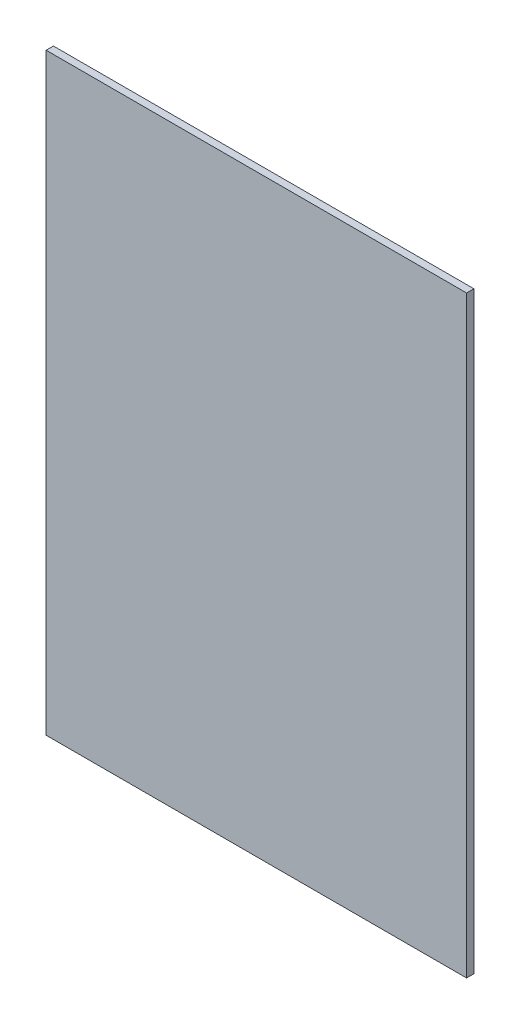
ISO-10303-21;
HEADER;
FILE_DESCRIPTION(('STEP AP214'),'2;1');
FILE_NAME('part.step','',(''),(''),'','','');
FILE_SCHEMA(('AUTOMOTIVE_DESIGN { 1 0 10303 214 1 1 1 1 }'));
ENDSEC;
DATA;
#1=APPLICATION_CONTEXT('core data for automotive mechanical design processes');
#2=APPLICATION_PROTOCOL_DEFINITION('international standard','automotive_design',2000,#1);
#3=PRODUCT_CONTEXT('',#1,'mechanical');
#4=PRODUCT('Part','Part','',(#3));
#5=PRODUCT_RELATED_PRODUCT_CATEGORY('part','',(#4));
#6=PRODUCT_DEFINITION_FORMATION('','',#4);
#7=PRODUCT_DEFINITION_CONTEXT('part definition',#1,'design');
#8=PRODUCT_DEFINITION('design','',#6,#7);
#9=PRODUCT_DEFINITION_SHAPE('','',#8);
#10=(LENGTH_UNIT() NAMED_UNIT(*) SI_UNIT(.MILLI.,.METRE.));
#11=(NAMED_UNIT(*) PLANE_ANGLE_UNIT() SI_UNIT($,.RADIAN.));
#12=(NAMED_UNIT(*) SI_UNIT($,.STERADIAN.) SOLID_ANGLE_UNIT());
#13=UNCERTAINTY_MEASURE_WITH_UNIT(LENGTH_MEASURE(1.E-05),#10,'distance_accuracy_value','');
#14=(GEOMETRIC_REPRESENTATION_CONTEXT(3) GLOBAL_UNCERTAINTY_ASSIGNED_CONTEXT((#13)) GLOBAL_UNIT_ASSIGNED_CONTEXT((#10,
#11,#12)) REPRESENTATION_CONTEXT('',''));
#15=CARTESIAN_POINT('',(0.,0.,0.));
#16=DIRECTION('',(0.,0.,1.));
#17=DIRECTION('',(1.,0.,0.));
#18=AXIS2_PLACEMENT_3D('',#15,#16,#17);
#19=CARTESIAN_POINT('',(0.,0.,3.));
#20=DIRECTION('',(1.,0.,0.));
#21=DIRECTION('',(0.,0.,-1.));
#22=AXIS2_PLACEMENT_3D('',#19,#20,#21);
#23=PLANE('',#22);
#24=DIRECTION('',(0.,-1.,0.));
#25=VECTOR('',#24,1.);
#26=CARTESIAN_POINT('',(0.,0.,0.));
#27=LINE('',#26,#25);
#28=CARTESIAN_POINT('',(0.,243.83,0.));
#29=VERTEX_POINT('',#28);
#30=CARTESIAN_POINT('',(0.,0.,0.));
#31=VERTEX_POINT('',#30);
#32=EDGE_CURVE('E107',#29,#31,#27,.T.);
#33=ORIENTED_EDGE('',*,*,#32,.T.);
#34=DIRECTION('',(0.,0.,-1.));
#35=VECTOR('',#34,1.);
#36=CARTESIAN_POINT('',(0.,0.,3.));
#37=LINE('',#36,#35);
#38=CARTESIAN_POINT('',(0.,0.,3.));
#39=VERTEX_POINT('',#38);
#40=EDGE_CURVE('E11',#39,#31,#37,.T.);
#41=ORIENTED_EDGE('',*,*,#40,.F.);
#42=DIRECTION('',(0.,-1.,0.));
#43=VECTOR('',#42,1.);
#44=CARTESIAN_POINT('',(0.,0.,3.));
#45=LINE('',#44,#43);
#46=CARTESIAN_POINT('',(0.,243.83,3.));
#47=VERTEX_POINT('',#46);
#48=EDGE_CURVE('E91',#47,#39,#45,.T.);
#49=ORIENTED_EDGE('',*,*,#48,.F.);
#50=DIRECTION('',(0.,0.,-1.));
#51=VECTOR('',#50,1.);
#52=CARTESIAN_POINT('',(0.,243.83,3.));
#53=LINE('',#52,#51);
#54=EDGE_CURVE('E103',#47,#29,#53,.T.);
#55=ORIENTED_EDGE('',*,*,#54,.T.);
#56=EDGE_LOOP('',(#33,#41,#49,#55));
#57=FACE_BOUND('',#56,.T.);
#58=ADVANCED_FACE('F39',(#57),#23,.F.);
#59=CARTESIAN_POINT('',(0.,0.,3.));
#60=DIRECTION('',(0.,1.,0.));
#61=DIRECTION('',(0.,0.,1.));
#62=AXIS2_PLACEMENT_3D('',#59,#60,#61);
#63=PLANE('',#62);
#64=DIRECTION('',(1.,0.,0.));
#65=VECTOR('',#64,1.);
#66=CARTESIAN_POINT('',(0.,0.,0.));
#67=LINE('',#66,#65);
#68=CARTESIAN_POINT('',(172.8,0.,0.));
#69=VERTEX_POINT('',#68);
#70=EDGE_CURVE('E96',#31,#69,#67,.T.);
#71=ORIENTED_EDGE('',*,*,#70,.T.);
#72=DIRECTION('',(0.,0.,-1.));
#73=VECTOR('',#72,1.);
#74=CARTESIAN_POINT('',(172.8,0.,3.));
#75=LINE('',#74,#73);
#76=CARTESIAN_POINT('',(172.8,0.,3.));
#77=VERTEX_POINT('',#76);
#78=EDGE_CURVE('E48',#77,#69,#75,.T.);
#79=ORIENTED_EDGE('',*,*,#78,.F.);
#80=DIRECTION('',(1.,0.,0.));
#81=VECTOR('',#80,1.);
#82=CARTESIAN_POINT('',(0.,0.,3.));
#83=LINE('',#82,#81);
#84=EDGE_CURVE('E86',#39,#77,#83,.T.);
#85=ORIENTED_EDGE('',*,*,#84,.F.);
#86=ORIENTED_EDGE('',*,*,#40,.T.);
#87=EDGE_LOOP('',(#71,#79,#85,#86));
#88=FACE_BOUND('',#87,.T.);
#89=ADVANCED_FACE('F95',(#88),#63,.F.);
#90=CARTESIAN_POINT('',(172.8,0.,3.));
#91=DIRECTION('',(-1.,0.,0.));
#92=DIRECTION('',(0.,0.,1.));
#93=AXIS2_PLACEMENT_3D('',#90,#91,#92);
#94=PLANE('',#93);
#95=DIRECTION('',(0.,1.,0.));
#96=VECTOR('',#95,1.);
#97=CARTESIAN_POINT('',(172.8,0.,0.));
#98=LINE('',#97,#96);
#99=CARTESIAN_POINT('',(172.8,243.83,0.));
#100=VERTEX_POINT('',#99);
#101=EDGE_CURVE('E73',#69,#100,#98,.T.);
#102=ORIENTED_EDGE('',*,*,#101,.T.);
#103=DIRECTION('',(0.,0.,-1.));
#104=VECTOR('',#103,1.);
#105=CARTESIAN_POINT('',(172.8,243.83,3.));
#106=LINE('',#105,#104);
#107=CARTESIAN_POINT('',(172.8,243.83,3.));
#108=VERTEX_POINT('',#107);
#109=EDGE_CURVE('E98',#108,#100,#106,.T.);
#110=ORIENTED_EDGE('',*,*,#109,.F.);
#111=DIRECTION('',(0.,1.,0.));
#112=VECTOR('',#111,1.);
#113=CARTESIAN_POINT('',(172.8,0.,3.));
#114=LINE('',#113,#112);
#115=EDGE_CURVE('E89',#77,#108,#114,.T.);
#116=ORIENTED_EDGE('',*,*,#115,.F.);
#117=ORIENTED_EDGE('',*,*,#78,.T.);
#118=EDGE_LOOP('',(#102,#110,#116,#117));
#119=FACE_BOUND('',#118,.T.);
#120=ADVANCED_FACE('F99',(#119),#94,.F.);
#121=CARTESIAN_POINT('',(0.,243.83,3.));
#122=DIRECTION('',(0.,-1.,0.));
#123=DIRECTION('',(0.,0.,-1.));
#124=AXIS2_PLACEMENT_3D('',#121,#122,#123);
#125=PLANE('',#124);
#126=DIRECTION('',(-1.,0.,0.));
#127=VECTOR('',#126,1.);
#128=CARTESIAN_POINT('',(0.,243.83,0.));
#129=LINE('',#128,#127);
#130=EDGE_CURVE('E79',#100,#29,#129,.T.);
#131=ORIENTED_EDGE('',*,*,#130,.T.);
#132=ORIENTED_EDGE('',*,*,#54,.F.);
#133=DIRECTION('',(-1.,0.,0.));
#134=VECTOR('',#133,1.);
#135=CARTESIAN_POINT('',(0.,243.83,3.));
#136=LINE('',#135,#134);
#137=EDGE_CURVE('E56',#108,#47,#136,.T.);
#138=ORIENTED_EDGE('',*,*,#137,.F.);
#139=ORIENTED_EDGE('',*,*,#109,.T.);
#140=EDGE_LOOP('',(#131,#132,#138,#139));
#141=FACE_BOUND('',#140,.T.);
#142=ADVANCED_FACE('F120',(#141),#125,.F.);
#143=CARTESIAN_POINT('',(0.,0.,3.));
#144=DIRECTION('',(0.,0.,-1.));
#145=DIRECTION('',(-1.,0.,0.));
#146=AXIS2_PLACEMENT_3D('',#143,#144,#145);
#147=PLANE('',#146);
#148=ORIENTED_EDGE('',*,*,#48,.T.);
#149=ORIENTED_EDGE('',*,*,#84,.T.);
#150=ORIENTED_EDGE('',*,*,#115,.T.);
#151=ORIENTED_EDGE('',*,*,#137,.T.);
#152=EDGE_LOOP('',(#148,#149,#150,#151));
#153=FACE_BOUND('',#152,.T.);
#154=ADVANCED_FACE('F87',(#153),#147,.F.);
#155=CARTESIAN_POINT('',(0.,0.,0.));
#156=DIRECTION('',(0.,0.,-1.));
#157=DIRECTION('',(-1.,0.,0.));
#158=AXIS2_PLACEMENT_3D('',#155,#156,#157);
#159=PLANE('',#158);
#160=ORIENTED_EDGE('',*,*,#32,.F.);
#161=ORIENTED_EDGE('',*,*,#130,.F.);
#162=ORIENTED_EDGE('',*,*,#101,.F.);
#163=ORIENTED_EDGE('',*,*,#70,.F.);
#164=EDGE_LOOP('',(#160,#161,#162,#163));
#165=FACE_BOUND('',#164,.T.);
#166=ADVANCED_FACE('F123',(#165),#159,.T.);
#167=CLOSED_SHELL('',(#58,#89,#120,#142,#154,#166));
#168=MANIFOLD_SOLID_BREP('B2',#167);
#169=ADVANCED_BREP_SHAPE_REPRESENTATION('',(#18,#168),#14);
#170=SHAPE_DEFINITION_REPRESENTATION(#9,#169);
ENDSEC;
END-ISO-10303-21;
